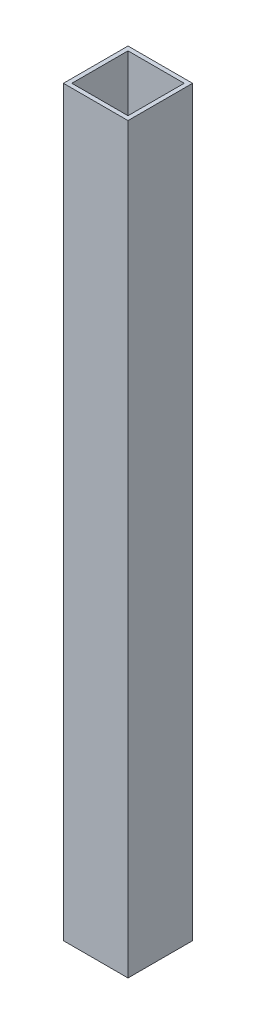
ISO-10303-21;
HEADER;
FILE_DESCRIPTION(('STEP AP214'),'2;1');
FILE_NAME('part.step','',(''),(''),'','','');
FILE_SCHEMA(('AUTOMOTIVE_DESIGN { 1 0 10303 214 1 1 1 1 }'));
ENDSEC;
DATA;
#1=APPLICATION_CONTEXT('core data for automotive mechanical design processes');
#2=APPLICATION_PROTOCOL_DEFINITION('international standard','automotive_design',2000,#1);
#3=PRODUCT_CONTEXT('',#1,'mechanical');
#4=PRODUCT('Part','Part','',(#3));
#5=PRODUCT_RELATED_PRODUCT_CATEGORY('part','',(#4));
#6=PRODUCT_DEFINITION_FORMATION('','',#4);
#7=PRODUCT_DEFINITION_CONTEXT('part definition',#1,'design');
#8=PRODUCT_DEFINITION('design','',#6,#7);
#9=PRODUCT_DEFINITION_SHAPE('','',#8);
#10=(LENGTH_UNIT() NAMED_UNIT(*) SI_UNIT(.MILLI.,.METRE.));
#11=(NAMED_UNIT(*) PLANE_ANGLE_UNIT() SI_UNIT($,.RADIAN.));
#12=(NAMED_UNIT(*) SI_UNIT($,.STERADIAN.) SOLID_ANGLE_UNIT());
#13=UNCERTAINTY_MEASURE_WITH_UNIT(LENGTH_MEASURE(1.E-05),#10,'distance_accuracy_value','');
#14=(GEOMETRIC_REPRESENTATION_CONTEXT(3) GLOBAL_UNCERTAINTY_ASSIGNED_CONTEXT((#13)) GLOBAL_UNIT_ASSIGNED_CONTEXT((#10,
#11,#12)) REPRESENTATION_CONTEXT('',''));
#15=CARTESIAN_POINT('',(0.,0.,0.));
#16=DIRECTION('',(0.,0.,1.));
#17=DIRECTION('',(1.,0.,0.));
#18=AXIS2_PLACEMENT_3D('',#15,#16,#17);
#19=CARTESIAN_POINT('',(0.,146.05,0.));
#20=DIRECTION('',(0.,1.,0.));
#21=DIRECTION('',(0.,0.,1.));
#22=AXIS2_PLACEMENT_3D('',#19,#20,#21);
#23=PLANE('',#22);
#24=DIRECTION('',(1.,0.,0.));
#25=VECTOR('',#24,1.);
#26=CARTESIAN_POINT('',(-12.7,146.05,-12.7));
#27=LINE('',#26,#25);
#28=CARTESIAN_POINT('',(-12.7,146.05,-12.7));
#29=VERTEX_POINT('',#28);
#30=CARTESIAN_POINT('',(12.7,146.05,-12.7));
#31=VERTEX_POINT('',#30);
#32=EDGE_CURVE('E137',#29,#31,#27,.T.);
#33=ORIENTED_EDGE('',*,*,#32,.F.);
#34=DIRECTION('',(0.,0.,-1.));
#35=VECTOR('',#34,1.);
#36=CARTESIAN_POINT('',(-12.7,146.05,12.7));
#37=LINE('',#36,#35);
#38=CARTESIAN_POINT('',(-12.7,146.05,12.7));
#39=VERTEX_POINT('',#38);
#40=EDGE_CURVE('E145',#39,#29,#37,.T.);
#41=ORIENTED_EDGE('',*,*,#40,.F.);
#42=DIRECTION('',(1.,0.,0.));
#43=VECTOR('',#42,1.);
#44=CARTESIAN_POINT('',(-12.7,146.05,12.7));
#45=LINE('',#44,#43);
#46=CARTESIAN_POINT('',(12.7,146.05,12.7));
#47=VERTEX_POINT('',#46);
#48=EDGE_CURVE('E143',#39,#47,#45,.T.);
#49=ORIENTED_EDGE('',*,*,#48,.T.);
#50=DIRECTION('',(0.,0.,-1.));
#51=VECTOR('',#50,1.);
#52=CARTESIAN_POINT('',(12.7,146.05,12.7));
#53=LINE('',#52,#51);
#54=EDGE_CURVE('E140',#47,#31,#53,.T.);
#55=ORIENTED_EDGE('',*,*,#54,.T.);
#56=EDGE_LOOP('',(#33,#41,#49,#55));
#57=FACE_BOUND('',#56,.T.);
#58=DIRECTION('',(0.,0.,-1.));
#59=VECTOR('',#58,1.);
#60=CARTESIAN_POINT('',(-11.049,146.05,11.049));
#61=LINE('',#60,#59);
#62=CARTESIAN_POINT('',(-11.049,146.05,11.049));
#63=VERTEX_POINT('',#62);
#64=CARTESIAN_POINT('',(-11.049,146.05,-11.049));
#65=VERTEX_POINT('',#64);
#66=EDGE_CURVE('E110',#63,#65,#61,.T.);
#67=ORIENTED_EDGE('',*,*,#66,.T.);
#68=DIRECTION('',(1.,0.,0.));
#69=VECTOR('',#68,1.);
#70=CARTESIAN_POINT('',(-11.049,146.05,-11.049));
#71=LINE('',#70,#69);
#72=CARTESIAN_POINT('',(11.049,146.05,-11.049));
#73=VERTEX_POINT('',#72);
#74=EDGE_CURVE('E52',#65,#73,#71,.T.);
#75=ORIENTED_EDGE('',*,*,#74,.T.);
#76=DIRECTION('',(0.,0.,-1.));
#77=VECTOR('',#76,1.);
#78=CARTESIAN_POINT('',(11.049,146.05,11.049));
#79=LINE('',#78,#77);
#80=CARTESIAN_POINT('',(11.049,146.05,11.049));
#81=VERTEX_POINT('',#80);
#82=EDGE_CURVE('E116',#81,#73,#79,.T.);
#83=ORIENTED_EDGE('',*,*,#82,.F.);
#84=DIRECTION('',(1.,0.,0.));
#85=VECTOR('',#84,1.);
#86=CARTESIAN_POINT('',(-11.049,146.05,11.049));
#87=LINE('',#86,#85);
#88=EDGE_CURVE('E128',#63,#81,#87,.T.);
#89=ORIENTED_EDGE('',*,*,#88,.F.);
#90=EDGE_LOOP('',(#67,#75,#83,#89));
#91=FACE_BOUND('',#90,.T.);
#92=ADVANCED_FACE('F35',(#57,#91),#23,.T.);
#93=CARTESIAN_POINT('',(0.,-146.05,0.));
#94=DIRECTION('',(0.,1.,0.));
#95=DIRECTION('',(0.,0.,1.));
#96=AXIS2_PLACEMENT_3D('',#93,#94,#95);
#97=PLANE('',#96);
#98=DIRECTION('',(1.,0.,0.));
#99=VECTOR('',#98,1.);
#100=CARTESIAN_POINT('',(-12.7,-146.05,-12.7));
#101=LINE('',#100,#99);
#102=CARTESIAN_POINT('',(-12.7,-146.05,-12.7));
#103=VERTEX_POINT('',#102);
#104=CARTESIAN_POINT('',(12.7,-146.05,-12.7));
#105=VERTEX_POINT('',#104);
#106=EDGE_CURVE('E117',#103,#105,#101,.T.);
#107=ORIENTED_EDGE('',*,*,#106,.T.);
#108=DIRECTION('',(0.,0.,-1.));
#109=VECTOR('',#108,1.);
#110=CARTESIAN_POINT('',(12.7,-146.05,12.7));
#111=LINE('',#110,#109);
#112=CARTESIAN_POINT('',(12.7,-146.05,12.7));
#113=VERTEX_POINT('',#112);
#114=EDGE_CURVE('E150',#113,#105,#111,.T.);
#115=ORIENTED_EDGE('',*,*,#114,.F.);
#116=DIRECTION('',(1.,0.,0.));
#117=VECTOR('',#116,1.);
#118=CARTESIAN_POINT('',(-12.7,-146.05,12.7));
#119=LINE('',#118,#117);
#120=CARTESIAN_POINT('',(-12.7,-146.05,12.7));
#121=VERTEX_POINT('',#120);
#122=EDGE_CURVE('E153',#121,#113,#119,.T.);
#123=ORIENTED_EDGE('',*,*,#122,.F.);
#124=DIRECTION('',(0.,0.,-1.));
#125=VECTOR('',#124,1.);
#126=CARTESIAN_POINT('',(-12.7,-146.05,12.7));
#127=LINE('',#126,#125);
#128=EDGE_CURVE('E141',#121,#103,#127,.T.);
#129=ORIENTED_EDGE('',*,*,#128,.T.);
#130=EDGE_LOOP('',(#107,#115,#123,#129));
#131=FACE_BOUND('',#130,.T.);
#132=DIRECTION('',(1.,0.,0.));
#133=VECTOR('',#132,1.);
#134=CARTESIAN_POINT('',(-11.049,-146.05,-11.049));
#135=LINE('',#134,#133);
#136=CARTESIAN_POINT('',(-11.049,-146.05,-11.049));
#137=VERTEX_POINT('',#136);
#138=CARTESIAN_POINT('',(11.049,-146.05,-11.049));
#139=VERTEX_POINT('',#138);
#140=EDGE_CURVE('E100',#137,#139,#135,.T.);
#141=ORIENTED_EDGE('',*,*,#140,.F.);
#142=DIRECTION('',(0.,0.,-1.));
#143=VECTOR('',#142,1.);
#144=CARTESIAN_POINT('',(-11.049,-146.05,11.049));
#145=LINE('',#144,#143);
#146=CARTESIAN_POINT('',(-11.049,-146.05,11.049));
#147=VERTEX_POINT('',#146);
#148=EDGE_CURVE('E122',#147,#137,#145,.T.);
#149=ORIENTED_EDGE('',*,*,#148,.F.);
#150=DIRECTION('',(1.,0.,0.));
#151=VECTOR('',#150,1.);
#152=CARTESIAN_POINT('',(-11.049,-146.05,11.049));
#153=LINE('',#152,#151);
#154=CARTESIAN_POINT('',(11.049,-146.05,11.049));
#155=VERTEX_POINT('',#154);
#156=EDGE_CURVE('E60',#147,#155,#153,.T.);
#157=ORIENTED_EDGE('',*,*,#156,.T.);
#158=DIRECTION('',(0.,0.,-1.));
#159=VECTOR('',#158,1.);
#160=CARTESIAN_POINT('',(11.049,-146.05,11.049));
#161=LINE('',#160,#159);
#162=EDGE_CURVE('E109',#155,#139,#161,.T.);
#163=ORIENTED_EDGE('',*,*,#162,.T.);
#164=EDGE_LOOP('',(#141,#149,#157,#163));
#165=FACE_BOUND('',#164,.T.);
#166=ADVANCED_FACE('F120',(#131,#165),#97,.F.);
#167=CARTESIAN_POINT('',(-12.7,146.05,-12.7));
#168=DIRECTION('',(0.,0.,-1.));
#169=DIRECTION('',(-1.,0.,0.));
#170=AXIS2_PLACEMENT_3D('',#167,#168,#169);
#171=PLANE('',#170);
#172=ORIENTED_EDGE('',*,*,#106,.F.);
#173=DIRECTION('',(0.,-1.,0.));
#174=VECTOR('',#173,1.);
#175=CARTESIAN_POINT('',(-12.7,146.05,-12.7));
#176=LINE('',#175,#174);
#177=EDGE_CURVE('E11',#29,#103,#176,.T.);
#178=ORIENTED_EDGE('',*,*,#177,.F.);
#179=ORIENTED_EDGE('',*,*,#32,.T.);
#180=DIRECTION('',(0.,-1.,0.));
#181=VECTOR('',#180,1.);
#182=CARTESIAN_POINT('',(12.7,146.05,-12.7));
#183=LINE('',#182,#181);
#184=EDGE_CURVE('E39',#31,#105,#183,.T.);
#185=ORIENTED_EDGE('',*,*,#184,.T.);
#186=EDGE_LOOP('',(#172,#178,#179,#185));
#187=FACE_BOUND('',#186,.T.);
#188=ADVANCED_FACE('F37',(#187),#171,.T.);
#189=CARTESIAN_POINT('',(-12.7,146.05,12.7));
#190=DIRECTION('',(-1.,0.,0.));
#191=DIRECTION('',(0.,0.,1.));
#192=AXIS2_PLACEMENT_3D('',#189,#190,#191);
#193=PLANE('',#192);
#194=ORIENTED_EDGE('',*,*,#128,.F.);
#195=DIRECTION('',(0.,-1.,0.));
#196=VECTOR('',#195,1.);
#197=CARTESIAN_POINT('',(-12.7,146.05,12.7));
#198=LINE('',#197,#196);
#199=EDGE_CURVE('E44',#39,#121,#198,.T.);
#200=ORIENTED_EDGE('',*,*,#199,.F.);
#201=ORIENTED_EDGE('',*,*,#40,.T.);
#202=ORIENTED_EDGE('',*,*,#177,.T.);
#203=EDGE_LOOP('',(#194,#200,#201,#202));
#204=FACE_BOUND('',#203,.T.);
#205=ADVANCED_FACE('F172',(#204),#193,.T.);
#206=CARTESIAN_POINT('',(-12.7,146.05,12.7));
#207=DIRECTION('',(0.,0.,-1.));
#208=DIRECTION('',(-1.,0.,0.));
#209=AXIS2_PLACEMENT_3D('',#206,#207,#208);
#210=PLANE('',#209);
#211=ORIENTED_EDGE('',*,*,#122,.T.);
#212=DIRECTION('',(0.,-1.,0.));
#213=VECTOR('',#212,1.);
#214=CARTESIAN_POINT('',(12.7,146.05,12.7));
#215=LINE('',#214,#213);
#216=EDGE_CURVE('E157',#47,#113,#215,.T.);
#217=ORIENTED_EDGE('',*,*,#216,.F.);
#218=ORIENTED_EDGE('',*,*,#48,.F.);
#219=ORIENTED_EDGE('',*,*,#199,.T.);
#220=EDGE_LOOP('',(#211,#217,#218,#219));
#221=FACE_BOUND('',#220,.T.);
#222=ADVANCED_FACE('F178',(#221),#210,.F.);
#223=CARTESIAN_POINT('',(12.7,146.05,12.7));
#224=DIRECTION('',(-1.,0.,0.));
#225=DIRECTION('',(0.,0.,1.));
#226=AXIS2_PLACEMENT_3D('',#223,#224,#225);
#227=PLANE('',#226);
#228=ORIENTED_EDGE('',*,*,#114,.T.);
#229=ORIENTED_EDGE('',*,*,#184,.F.);
#230=ORIENTED_EDGE('',*,*,#54,.F.);
#231=ORIENTED_EDGE('',*,*,#216,.T.);
#232=EDGE_LOOP('',(#228,#229,#230,#231));
#233=FACE_BOUND('',#232,.T.);
#234=ADVANCED_FACE('F167',(#233),#227,.F.);
#235=CARTESIAN_POINT('',(-11.049,-146.05,-11.049));
#236=DIRECTION('',(0.,0.,1.));
#237=DIRECTION('',(1.,0.,0.));
#238=AXIS2_PLACEMENT_3D('',#235,#236,#237);
#239=PLANE('',#238);
#240=ORIENTED_EDGE('',*,*,#74,.F.);
#241=DIRECTION('',(0.,1.,0.));
#242=VECTOR('',#241,1.);
#243=CARTESIAN_POINT('',(-11.049,-146.05,-11.049));
#244=LINE('',#243,#242);
#245=EDGE_CURVE('E105',#137,#65,#244,.T.);
#246=ORIENTED_EDGE('',*,*,#245,.F.);
#247=ORIENTED_EDGE('',*,*,#140,.T.);
#248=DIRECTION('',(0.,1.,0.));
#249=VECTOR('',#248,1.);
#250=CARTESIAN_POINT('',(11.049,-146.05,-11.049));
#251=LINE('',#250,#249);
#252=EDGE_CURVE('E103',#139,#73,#251,.T.);
#253=ORIENTED_EDGE('',*,*,#252,.T.);
#254=EDGE_LOOP('',(#240,#246,#247,#253));
#255=FACE_BOUND('',#254,.T.);
#256=ADVANCED_FACE('F102',(#255),#239,.T.);
#257=CARTESIAN_POINT('',(11.049,-146.05,11.049));
#258=DIRECTION('',(1.,0.,0.));
#259=DIRECTION('',(0.,0.,-1.));
#260=AXIS2_PLACEMENT_3D('',#257,#258,#259);
#261=PLANE('',#260);
#262=ORIENTED_EDGE('',*,*,#82,.T.);
#263=ORIENTED_EDGE('',*,*,#252,.F.);
#264=ORIENTED_EDGE('',*,*,#162,.F.);
#265=DIRECTION('',(0.,1.,0.));
#266=VECTOR('',#265,1.);
#267=CARTESIAN_POINT('',(11.049,-146.05,11.049));
#268=LINE('',#267,#266);
#269=EDGE_CURVE('E118',#155,#81,#268,.T.);
#270=ORIENTED_EDGE('',*,*,#269,.T.);
#271=EDGE_LOOP('',(#262,#263,#264,#270));
#272=FACE_BOUND('',#271,.T.);
#273=ADVANCED_FACE('F114',(#272),#261,.F.);
#274=CARTESIAN_POINT('',(-11.049,-146.05,11.049));
#275=DIRECTION('',(0.,0.,1.));
#276=DIRECTION('',(1.,0.,0.));
#277=AXIS2_PLACEMENT_3D('',#274,#275,#276);
#278=PLANE('',#277);
#279=ORIENTED_EDGE('',*,*,#88,.T.);
#280=ORIENTED_EDGE('',*,*,#269,.F.);
#281=ORIENTED_EDGE('',*,*,#156,.F.);
#282=DIRECTION('',(0.,1.,0.));
#283=VECTOR('',#282,1.);
#284=CARTESIAN_POINT('',(-11.049,-146.05,11.049));
#285=LINE('',#284,#283);
#286=EDGE_CURVE('E134',#147,#63,#285,.T.);
#287=ORIENTED_EDGE('',*,*,#286,.T.);
#288=EDGE_LOOP('',(#279,#280,#281,#287));
#289=FACE_BOUND('',#288,.T.);
#290=ADVANCED_FACE('F197',(#289),#278,.F.);
#291=CARTESIAN_POINT('',(-11.049,-146.05,11.049));
#292=DIRECTION('',(1.,0.,0.));
#293=DIRECTION('',(0.,0.,-1.));
#294=AXIS2_PLACEMENT_3D('',#291,#292,#293);
#295=PLANE('',#294);
#296=ORIENTED_EDGE('',*,*,#66,.F.);
#297=ORIENTED_EDGE('',*,*,#286,.F.);
#298=ORIENTED_EDGE('',*,*,#148,.T.);
#299=ORIENTED_EDGE('',*,*,#245,.T.);
#300=EDGE_LOOP('',(#296,#297,#298,#299));
#301=FACE_BOUND('',#300,.T.);
#302=ADVANCED_FACE('F200',(#301),#295,.T.);
#303=CLOSED_SHELL('',(#92,#166,#188,#205,#222,#234,#256,#273,#290,#302));
#304=MANIFOLD_SOLID_BREP('B2',#303);
#305=ADVANCED_BREP_SHAPE_REPRESENTATION('',(#18,#304),#14);
#306=SHAPE_DEFINITION_REPRESENTATION(#9,#305);
ENDSEC;
END-ISO-10303-21;
